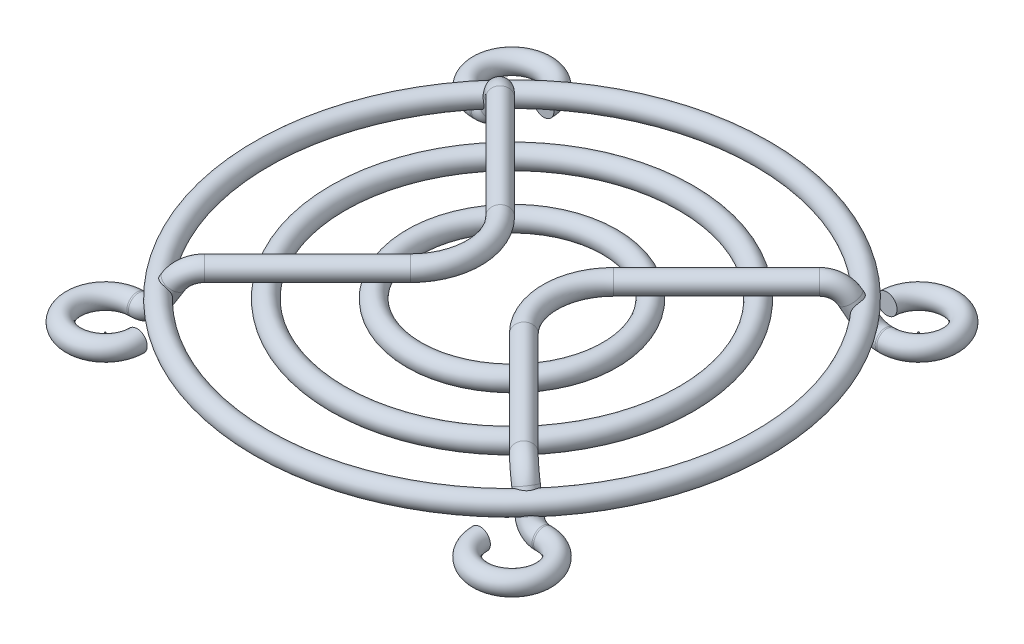
ISO-10303-21;
HEADER;
FILE_DESCRIPTION(('STEP AP214'),'2;1');
FILE_NAME('part.step','',(''),(''),'','','');
FILE_SCHEMA(('AUTOMOTIVE_DESIGN { 1 0 10303 214 1 1 1 1 }'));
ENDSEC;
DATA;
#1=APPLICATION_CONTEXT('core data for automotive mechanical design processes');
#2=APPLICATION_PROTOCOL_DEFINITION('international standard','automotive_design',2000,#1);
#3=PRODUCT_CONTEXT('',#1,'mechanical');
#4=PRODUCT('Part','Part','',(#3));
#5=PRODUCT_RELATED_PRODUCT_CATEGORY('part','',(#4));
#6=PRODUCT_DEFINITION_FORMATION('','',#4);
#7=PRODUCT_DEFINITION_CONTEXT('part definition',#1,'design');
#8=PRODUCT_DEFINITION('design','',#6,#7);
#9=PRODUCT_DEFINITION_SHAPE('','',#8);
#10=(LENGTH_UNIT() NAMED_UNIT(*) SI_UNIT(.MILLI.,.METRE.));
#11=(NAMED_UNIT(*) PLANE_ANGLE_UNIT() SI_UNIT($,.RADIAN.));
#12=(NAMED_UNIT(*) SI_UNIT($,.STERADIAN.) SOLID_ANGLE_UNIT());
#13=UNCERTAINTY_MEASURE_WITH_UNIT(LENGTH_MEASURE(1.E-05),#10,'distance_accuracy_value','');
#14=(GEOMETRIC_REPRESENTATION_CONTEXT(3) GLOBAL_UNCERTAINTY_ASSIGNED_CONTEXT((#13)) GLOBAL_UNIT_ASSIGNED_CONTEXT((#10,
#11,#12)) REPRESENTATION_CONTEXT('',''));
#15=CARTESIAN_POINT('',(0.,0.,0.));
#16=DIRECTION('',(0.,0.,1.));
#17=DIRECTION('',(1.,0.,0.));
#18=AXIS2_PLACEMENT_3D('',#15,#16,#17);
#19=CARTESIAN_POINT('',(16.,-2.3,-16.));
#20=DIRECTION('',(0.,-1.,0.));
#21=DIRECTION('',(0.,0.,-1.));
#22=AXIS2_PLACEMENT_3D('',#19,#20,#21);
#23=CYLINDRICAL_SURFACE('',#22,0.0528825222954187);
#24=CARTESIAN_POINT('',(16.,-2.3,-16.));
#25=DIRECTION('',(0.,1.,0.));
#26=DIRECTION('',(0.,0.,1.));
#27=AXIS2_PLACEMENT_3D('',#24,#25,#26);
#28=CIRCLE('',#27,0.0528825222954187);
#29=CARTESIAN_POINT('',(16.,-2.3,-15.9471174777046));
#30=VERTEX_POINT('',#29);
#31=EDGE_CURVE('E11',#30,#30,#28,.T.);
#32=ORIENTED_EDGE('',*,*,#31,.F.);
#33=EDGE_LOOP('',(#32));
#34=FACE_BOUND('',#33,.T.);
#35=CARTESIAN_POINT('',(16.,-2.4,-16.));
#36=DIRECTION('',(0.,1.,0.));
#37=DIRECTION('',(0.,0.,1.));
#38=AXIS2_PLACEMENT_3D('',#35,#36,#37);
#39=CIRCLE('',#38,0.0528825222954187);
#40=CARTESIAN_POINT('',(16.,-2.4,-15.9471174777046));
#41=VERTEX_POINT('',#40);
#42=EDGE_CURVE('E47',#41,#41,#39,.T.);
#43=ORIENTED_EDGE('',*,*,#42,.T.);
#44=EDGE_LOOP('',(#43));
#45=FACE_BOUND('',#44,.T.);
#46=ADVANCED_FACE('F44',(#34,#45),#23,.T.);
#47=CARTESIAN_POINT('',(0.,-2.3,0.));
#48=DIRECTION('',(0.,1.,0.));
#49=DIRECTION('',(0.,0.,1.));
#50=AXIS2_PLACEMENT_3D('',#47,#48,#49);
#51=PLANE('',#50);
#52=ORIENTED_EDGE('',*,*,#31,.T.);
#53=EDGE_LOOP('',(#52));
#54=FACE_BOUND('',#53,.T.);
#55=ADVANCED_FACE('F59',(#54),#51,.T.);
#56=CARTESIAN_POINT('',(0.,-2.4,0.));
#57=DIRECTION('',(0.,1.,0.));
#58=DIRECTION('',(0.,0.,1.));
#59=AXIS2_PLACEMENT_3D('',#56,#57,#58);
#60=PLANE('',#59);
#61=ORIENTED_EDGE('',*,*,#42,.F.);
#62=EDGE_LOOP('',(#61));
#63=FACE_BOUND('',#62,.T.);
#64=ADVANCED_FACE('F57',(#63),#60,.F.);
#65=CLOSED_SHELL('',(#46,#55,#64));
#66=MANIFOLD_SOLID_BREP('B2',#65);
#67=CARTESIAN_POINT('',(-16.,-2.3,16.));
#68=DIRECTION('',(0.,-1.,0.));
#69=DIRECTION('',(0.,0.,-1.));
#70=AXIS2_PLACEMENT_3D('',#67,#68,#69);
#71=CYLINDRICAL_SURFACE('',#70,0.0492604515738806);
#72=CARTESIAN_POINT('',(-16.,-2.3,16.));
#73=DIRECTION('',(0.,1.,0.));
#74=DIRECTION('',(0.,0.,1.));
#75=AXIS2_PLACEMENT_3D('',#72,#73,#74);
#76=CIRCLE('',#75,0.0492604515738806);
#77=CARTESIAN_POINT('',(-16.,-2.3,16.0492604515739));
#78=VERTEX_POINT('',#77);
#79=EDGE_CURVE('E43',#78,#78,#76,.T.);
#80=ORIENTED_EDGE('',*,*,#79,.F.);
#81=EDGE_LOOP('',(#80));
#82=FACE_BOUND('',#81,.T.);
#83=CARTESIAN_POINT('',(-16.,-2.4,16.));
#84=DIRECTION('',(0.,1.,0.));
#85=DIRECTION('',(0.,0.,1.));
#86=AXIS2_PLACEMENT_3D('',#83,#84,#85);
#87=CIRCLE('',#86,0.0492604515738806);
#88=CARTESIAN_POINT('',(-16.,-2.4,16.0492604515739));
#89=VERTEX_POINT('',#88);
#90=EDGE_CURVE('E96',#89,#89,#87,.T.);
#91=ORIENTED_EDGE('',*,*,#90,.T.);
#92=EDGE_LOOP('',(#91));
#93=FACE_BOUND('',#92,.T.);
#94=ADVANCED_FACE('F93',(#82,#93),#71,.T.);
#95=CARTESIAN_POINT('',(0.,-2.3,0.));
#96=DIRECTION('',(0.,1.,0.));
#97=DIRECTION('',(0.,0.,1.));
#98=AXIS2_PLACEMENT_3D('',#95,#96,#97);
#99=PLANE('',#98);
#100=ORIENTED_EDGE('',*,*,#79,.T.);
#101=EDGE_LOOP('',(#100));
#102=FACE_BOUND('',#101,.T.);
#103=ADVANCED_FACE('F108',(#102),#99,.T.);
#104=CARTESIAN_POINT('',(0.,-2.4,0.));
#105=DIRECTION('',(0.,1.,0.));
#106=DIRECTION('',(0.,0.,1.));
#107=AXIS2_PLACEMENT_3D('',#104,#105,#106);
#108=PLANE('',#107);
#109=ORIENTED_EDGE('',*,*,#90,.F.);
#110=EDGE_LOOP('',(#109));
#111=FACE_BOUND('',#110,.T.);
#112=ADVANCED_FACE('F106',(#111),#108,.F.);
#113=CLOSED_SHELL('',(#94,#103,#112));
#114=MANIFOLD_SOLID_BREP('B6',#113);
#115=CARTESIAN_POINT('',(16.,-1.6,-16.));
#116=DIRECTION('',(0.,-1.,0.));
#117=DIRECTION('',(0.,0.,-1.));
#118=AXIS2_PLACEMENT_3D('',#115,#116,#117);
#119=TOROIDAL_SURFACE('',#118,2.5,0.799999999999999);
#120=CARTESIAN_POINT('',(13.5,-1.6,-15.9999999999999));
#121=DIRECTION('',(0.,0.,-1.));
#122=DIRECTION('',(-1.,0.,0.));
#123=AXIS2_PLACEMENT_3D('',#120,#121,#122);
#124=CIRCLE('',#123,0.799999999999999);
#125=CARTESIAN_POINT('',(12.7,-1.6,-15.9999999999999));
#126=VERTEX_POINT('',#125);
#127=EDGE_CURVE('E92',#126,#126,#124,.T.);
#128=CARTESIAN_POINT('',(16.,-1.6,-13.5));
#129=DIRECTION('',(-1.,0.,0.));
#130=DIRECTION('',(0.,0.,1.));
#131=AXIS2_PLACEMENT_3D('',#128,#129,#130);
#132=CIRCLE('',#131,0.799999999999999);
#133=CARTESIAN_POINT('',(16.,-1.6,-12.7));
#134=VERTEX_POINT('',#133);
#135=EDGE_CURVE('E147',#134,#134,#132,.T.);
#136=CARTESIAN_POINT('',(16.,-1.6,-16.));
#137=DIRECTION('',(0.,-1.,0.));
#138=DIRECTION('',(0.,0.,-1.));
#139=AXIS2_PLACEMENT_3D('',#136,#137,#138);
#140=CIRCLE('',#139,3.3);
#141=EDGE_CURVE('',#126,#134,#140,.T.);
#142=ORIENTED_EDGE('',*,*,#127,.T.);
#143=ORIENTED_EDGE('',*,*,#135,.F.);
#144=ORIENTED_EDGE('',*,*,#141,.T.);
#145=ORIENTED_EDGE('',*,*,#141,.F.);
#146=EDGE_LOOP('',(#142,#144,#143,#145));
#147=FACE_BOUND('',#146,.T.);
#148=ADVANCED_FACE('F141',(#147),#119,.T.);
#149=CARTESIAN_POINT('',(15.8782443274926,-1.6,-13.5));
#150=DIRECTION('',(1.,0.,0.));
#151=DIRECTION('',(0.,-1.,0.));
#152=AXIS2_PLACEMENT_3D('',#149,#150,#151);
#153=CYLINDRICAL_SURFACE('',#152,0.799999999999999);
#154=CARTESIAN_POINT('',(15.8782443274926,-1.6,-13.5));
#155=DIRECTION('',(-1.,0.,0.));
#156=DIRECTION('',(0.,0.,1.));
#157=AXIS2_PLACEMENT_3D('',#154,#155,#156);
#158=CIRCLE('',#157,0.799999999999999);
#159=CARTESIAN_POINT('',(15.8782443274926,-2.35955153182212,-13.7511602486594));
#160=VERTEX_POINT('',#159);
#161=EDGE_CURVE('E151',#160,#160,#158,.T.);
#162=ORIENTED_EDGE('',*,*,#161,.F.);
#163=EDGE_LOOP('',(#162));
#164=FACE_BOUND('',#163,.T.);
#165=ORIENTED_EDGE('',*,*,#135,.T.);
#166=EDGE_LOOP('',(#165));
#167=FACE_BOUND('',#166,.T.);
#168=ADVANCED_FACE('F209',(#164,#167),#153,.T.);
#169=CARTESIAN_POINT('',(15.8782443274925,-0.27078481931128,-13.060469564846));
#170=DIRECTION('',(0.,0.313950310824281,-0.949439414777656));
#171=DIRECTION('',(0.,0.949439414777656,0.313950310824281));
#172=AXIS2_PLACEMENT_3D('',#169,#170,#171);
#173=TOROIDAL_SURFACE('',#172,1.4,0.799999999999999);
#174=CARTESIAN_POINT('',(14.617781817604,-0.849268726889301,-13.2517563386666));
#175=DIRECTION('',(-0.435207117690497,0.854809134098411,0.282658997687063));
#176=DIRECTION('',(0.282658997687048,-0.168351654670458,0.944331303831591));
#177=AXIS2_PLACEMENT_3D('',#174,#175,#176);
#178=CIRCLE('',#177,0.799999999999999);
#179=CARTESIAN_POINT('',(13.8975175262391,-1.17983095979103,-13.3610630665641));
#180=VERTEX_POINT('',#179);
#181=EDGE_CURVE('E155',#180,#180,#178,.T.);
#182=CARTESIAN_POINT('',(15.8782443274925,-0.27078481931128,-13.060469564846));
#183=DIRECTION('',(0.,0.313950310824281,-0.949439414777656));
#184=DIRECTION('',(0.,0.949439414777656,0.313950310824281));
#185=AXIS2_PLACEMENT_3D('',#182,#183,#184);
#186=CIRCLE('',#185,2.2);
#187=EDGE_CURVE('',#160,#180,#186,.T.);
#188=ORIENTED_EDGE('',*,*,#161,.T.);
#189=ORIENTED_EDGE('',*,*,#181,.F.);
#190=ORIENTED_EDGE('',*,*,#187,.T.);
#191=ORIENTED_EDGE('',*,*,#187,.F.);
#192=EDGE_LOOP('',(#188,#190,#189,#191));
#193=FACE_BOUND('',#192,.T.);
#194=ADVANCED_FACE('F214',(#193),#173,.T.);
#195=CARTESIAN_POINT('',(13.868227009508,0.622964309803443,-12.764934312657));
#196=DIRECTION('',(0.435207117690503,-0.854809134098413,-0.282658997687049));
#197=DIRECTION('',(-0.891149813497045,-0.453709168856199,0.));
#198=AXIS2_PLACEMENT_3D('',#195,#196,#197);
#199=CYLINDRICAL_SURFACE('',#198,0.799999999999999);
#200=CARTESIAN_POINT('',(13.868227009508,0.622964309803443,-12.764934312657));
#201=DIRECTION('',(-0.435207117690497,0.854809134098411,0.282658997687063));
#202=DIRECTION('',(0.282658997687048,-0.168351654670458,0.944331303831591));
#203=AXIS2_PLACEMENT_3D('',#200,#201,#202);
#204=CIRCLE('',#203,0.799999999999999);
#205=CARTESIAN_POINT('',(14.3196651347374,1.02585560697572,-13.2882718918086));
#206=VERTEX_POINT('',#205);
#207=EDGE_CURVE('E160',#206,#206,#204,.T.);
#208=ORIENTED_EDGE('',*,*,#207,.F.);
#209=EDGE_LOOP('',(#208));
#210=FACE_BOUND('',#209,.T.);
#211=ORIENTED_EDGE('',*,*,#181,.T.);
#212=EDGE_LOOP('',(#211));
#213=FACE_BOUND('',#212,.T.);
#214=ADVANCED_FACE('F219',(#210,#213),#199,.T.);
#215=CARTESIAN_POINT('',(12.7396316964346,-0.384263933127245,-11.4565903647781));
#216=DIRECTION('',(0.701543241389086,0.125196489258284,0.701543241389078));
#217=DIRECTION('',(-0.707106781186543,0.,0.707106781186551));
#218=AXIS2_PLACEMENT_3D('',#215,#216,#217);
#219=TOROIDAL_SURFACE('',#218,2.,0.799999999999999);
#220=CARTESIAN_POINT('',(12.5625771233641,1.6,-11.6336449378486));
#221=DIRECTION('',(-0.707106781186535,0.,0.707106781186561));
#222=DIRECTION('',(0.637166139093873,-0.43363420343009,0.637166139093846));
#223=AXIS2_PLACEMENT_3D('',#220,#221,#222);
#224=CIRCLE('',#223,0.799999999999999);
#225=CARTESIAN_POINT('',(12.4917552941358,2.3937055732509,-11.7044667670769));
#226=VERTEX_POINT('',#225);
#227=EDGE_CURVE('E163',#226,#226,#224,.T.);
#228=CARTESIAN_POINT('',(12.7396316964346,-0.384263933127245,-11.4565903647781));
#229=DIRECTION('',(0.701543241389086,0.125196489258284,0.701543241389078));
#230=DIRECTION('',(-0.707106781186543,0.,0.707106781186551));
#231=AXIS2_PLACEMENT_3D('',#228,#229,#230);
#232=CIRCLE('',#231,2.8);
#233=EDGE_CURVE('',#206,#226,#232,.T.);
#234=ORIENTED_EDGE('',*,*,#207,.T.);
#235=ORIENTED_EDGE('',*,*,#227,.F.);
#236=ORIENTED_EDGE('',*,*,#233,.T.);
#237=ORIENTED_EDGE('',*,*,#233,.F.);
#238=EDGE_LOOP('',(#234,#236,#235,#237));
#239=FACE_BOUND('',#238,.T.);
#240=ADVANCED_FACE('F226',(#239),#219,.T.);
#241=CARTESIAN_POINT('',(4.46446609275775,1.6,-3.53553390724225));
#242=DIRECTION('',(0.707106781186544,0.,-0.707106781186551));
#243=DIRECTION('',(0.707106781186551,0.,0.707106781186544));
#244=AXIS2_PLACEMENT_3D('',#241,#242,#243);
#245=CYLINDRICAL_SURFACE('',#244,0.799999999999999);
#246=CARTESIAN_POINT('',(4.46446609275775,1.6,-3.53553390724225));
#247=DIRECTION('',(-0.707106781186535,0.,0.707106781186561));
#248=DIRECTION('',(0.637166139093873,-0.43363420343009,0.637166139093846));
#249=AXIS2_PLACEMENT_3D('',#246,#247,#248);
#250=CIRCLE('',#249,0.799999999999999);
#251=CARTESIAN_POINT('',(3.89878066780852,1.6,-4.10121933219149));
#252=VERTEX_POINT('',#251);
#253=EDGE_CURVE('E166',#252,#252,#250,.T.);
#254=ORIENTED_EDGE('',*,*,#253,.F.);
#255=EDGE_LOOP('',(#254));
#256=FACE_BOUND('',#255,.T.);
#257=ORIENTED_EDGE('',*,*,#227,.T.);
#258=EDGE_LOOP('',(#257));
#259=FACE_BOUND('',#258,.T.);
#260=ADVANCED_FACE('F230',(#256,#259),#245,.T.);
#261=CARTESIAN_POINT('',(8.,1.6,0.));
#262=DIRECTION('',(0.,1.,0.));
#263=DIRECTION('',(0.,0.,1.));
#264=AXIS2_PLACEMENT_3D('',#261,#262,#263);
#265=TOROIDAL_SURFACE('',#264,5.00000000185193,0.799999999999999);
#266=CARTESIAN_POINT('',(4.46446609275775,1.6,3.53553390724226));
#267=DIRECTION('',(0.707106781186562,0.,0.707106781186533));
#268=DIRECTION('',(0.637166139093845,-0.43363420343009,-0.637166139093874));
#269=AXIS2_PLACEMENT_3D('',#266,#267,#268);
#270=CIRCLE('',#269,0.799999999999999);
#271=CARTESIAN_POINT('',(3.89878066780852,1.6,4.10121933219149));
#272=VERTEX_POINT('',#271);
#273=EDGE_CURVE('E169',#272,#272,#270,.T.);
#274=CARTESIAN_POINT('',(8.,1.6,0.));
#275=DIRECTION('',(0.,1.,0.));
#276=DIRECTION('',(0.,0.,1.));
#277=AXIS2_PLACEMENT_3D('',#274,#275,#276);
#278=CIRCLE('',#277,5.80000000185193);
#279=EDGE_CURVE('',#252,#272,#278,.T.);
#280=ORIENTED_EDGE('',*,*,#253,.T.);
#281=ORIENTED_EDGE('',*,*,#273,.F.);
#282=ORIENTED_EDGE('',*,*,#279,.T.);
#283=ORIENTED_EDGE('',*,*,#279,.F.);
#284=EDGE_LOOP('',(#280,#282,#281,#283));
#285=FACE_BOUND('',#284,.T.);
#286=ADVANCED_FACE('F234',(#285),#265,.T.);
#287=CARTESIAN_POINT('',(12.5625771233642,1.6,11.6336449378485));
#288=DIRECTION('',(-0.707106781186554,0.,-0.707106781186541));
#289=DIRECTION('',(0.707106781186541,0.,-0.707106781186554));
#290=AXIS2_PLACEMENT_3D('',#287,#288,#289);
#291=CYLINDRICAL_SURFACE('',#290,0.799999999999999);
#292=CARTESIAN_POINT('',(12.5625771233642,1.6,11.6336449378485));
#293=DIRECTION('',(0.707106781186562,0.,0.707106781186533));
#294=DIRECTION('',(0.637166139093845,-0.43363420343009,-0.637166139093874));
#295=AXIS2_PLACEMENT_3D('',#292,#293,#294);
#296=CIRCLE('',#295,0.799999999999999);
#297=CARTESIAN_POINT('',(12.491755294136,2.3937055732509,11.7044667670767));
#298=VERTEX_POINT('',#297);
#299=EDGE_CURVE('E172',#298,#298,#296,.T.);
#300=ORIENTED_EDGE('',*,*,#299,.F.);
#301=EDGE_LOOP('',(#300));
#302=FACE_BOUND('',#301,.T.);
#303=ORIENTED_EDGE('',*,*,#273,.T.);
#304=EDGE_LOOP('',(#303));
#305=FACE_BOUND('',#304,.T.);
#306=ADVANCED_FACE('F238',(#302,#305),#291,.T.);
#307=CARTESIAN_POINT('',(12.7396316964347,-0.38426393312726,11.4565903647781));
#308=DIRECTION('',(0.701543241389082,0.125196489258224,-0.701543241389094));
#309=DIRECTION('',(0.707106781186554,0.,0.707106781186541));
#310=AXIS2_PLACEMENT_3D('',#307,#308,#309);
#311=TOROIDAL_SURFACE('',#310,2.,0.799999999999999);
#312=CARTESIAN_POINT('',(13.8682270095081,0.62296430980346,12.764934312657));
#313=DIRECTION('',(0.435207117690463,-0.85480913409843,0.282658997687058));
#314=DIRECTION('',(0.282658997687064,-0.168351654670452,-0.944331303831587));
#315=AXIS2_PLACEMENT_3D('',#312,#313,#314);
#316=CIRCLE('',#315,0.799999999999999);
#317=CARTESIAN_POINT('',(14.3196651347375,1.02585560697575,13.2882718918085));
#318=VERTEX_POINT('',#317);
#319=EDGE_CURVE('E175',#318,#318,#316,.T.);
#320=CARTESIAN_POINT('',(12.7396316964347,-0.38426393312726,11.4565903647781));
#321=DIRECTION('',(0.701543241389082,0.125196489258224,-0.701543241389094));
#322=DIRECTION('',(0.707106781186554,0.,0.707106781186541));
#323=AXIS2_PLACEMENT_3D('',#320,#321,#322);
#324=CIRCLE('',#323,2.8);
#325=EDGE_CURVE('',#298,#318,#324,.T.);
#326=ORIENTED_EDGE('',*,*,#299,.T.);
#327=ORIENTED_EDGE('',*,*,#319,.F.);
#328=ORIENTED_EDGE('',*,*,#325,.T.);
#329=ORIENTED_EDGE('',*,*,#325,.F.);
#330=EDGE_LOOP('',(#326,#328,#327,#329));
#331=FACE_BOUND('',#330,.T.);
#332=ADVANCED_FACE('F242',(#331),#311,.T.);
#333=CARTESIAN_POINT('',(14.6177818176039,-0.8492687268892,13.2517563386666));
#334=DIRECTION('',(-0.435207117690459,0.854809134098428,-0.282658997687071));
#335=DIRECTION('',(0.891149813497066,0.453709168856156,0.));
#336=AXIS2_PLACEMENT_3D('',#333,#334,#335);
#337=CYLINDRICAL_SURFACE('',#336,0.799999999999999);
#338=CARTESIAN_POINT('',(14.6177818176039,-0.8492687268892,13.2517563386666));
#339=DIRECTION('',(0.435207117690463,-0.85480913409843,0.282658997687058));
#340=DIRECTION('',(0.282658997687064,-0.168351654670452,-0.944331303831587));
#341=AXIS2_PLACEMENT_3D('',#338,#339,#340);
#342=CIRCLE('',#341,0.799999999999999);
#343=CARTESIAN_POINT('',(13.897517526239,-1.17983095979086,13.3610630665641));
#344=VERTEX_POINT('',#343);
#345=EDGE_CURVE('E178',#344,#344,#342,.T.);
#346=ORIENTED_EDGE('',*,*,#345,.F.);
#347=EDGE_LOOP('',(#346));
#348=FACE_BOUND('',#347,.T.);
#349=ORIENTED_EDGE('',*,*,#319,.T.);
#350=EDGE_LOOP('',(#349));
#351=FACE_BOUND('',#350,.T.);
#352=ADVANCED_FACE('F246',(#348,#351),#337,.T.);
#353=CARTESIAN_POINT('',(15.8782443274926,-0.270784819311289,13.060469564846));
#354=DIRECTION('',(0.,0.313950310824296,0.949439414777651));
#355=DIRECTION('',(0.,-0.949439414777651,0.313950310824296));
#356=AXIS2_PLACEMENT_3D('',#353,#354,#355);
#357=TOROIDAL_SURFACE('',#356,1.4,0.799999999999999);
#358=CARTESIAN_POINT('',(15.8782443274925,-1.6,13.5));
#359=DIRECTION('',(1.,0.,0.));
#360=DIRECTION('',(0.,0.,-1.));
#361=AXIS2_PLACEMENT_3D('',#358,#359,#360);
#362=CIRCLE('',#361,0.799999999999999);
#363=CARTESIAN_POINT('',(15.8782443274925,-2.35955153182212,13.7511602486594));
#364=VERTEX_POINT('',#363);
#365=EDGE_CURVE('E181',#364,#364,#362,.T.);
#366=CARTESIAN_POINT('',(15.8782443274926,-0.270784819311289,13.060469564846));
#367=DIRECTION('',(0.,0.313950310824296,0.949439414777651));
#368=DIRECTION('',(0.,-0.949439414777651,0.313950310824296));
#369=AXIS2_PLACEMENT_3D('',#366,#367,#368);
#370=CIRCLE('',#369,2.2);
#371=EDGE_CURVE('',#344,#364,#370,.T.);
#372=ORIENTED_EDGE('',*,*,#345,.T.);
#373=ORIENTED_EDGE('',*,*,#365,.F.);
#374=ORIENTED_EDGE('',*,*,#371,.T.);
#375=ORIENTED_EDGE('',*,*,#371,.F.);
#376=EDGE_LOOP('',(#372,#374,#373,#375));
#377=FACE_BOUND('',#376,.T.);
#378=ADVANCED_FACE('F205',(#377),#357,.T.);
#379=CARTESIAN_POINT('',(16.,-1.6,13.5));
#380=DIRECTION('',(-1.,0.,0.));
#381=DIRECTION('',(0.,1.,0.));
#382=AXIS2_PLACEMENT_3D('',#379,#380,#381);
#383=CYLINDRICAL_SURFACE('',#382,0.799999999999999);
#384=CARTESIAN_POINT('',(16.,-1.6,13.5));
#385=DIRECTION('',(1.,0.,0.));
#386=DIRECTION('',(0.,0.,-1.));
#387=AXIS2_PLACEMENT_3D('',#384,#385,#386);
#388=CIRCLE('',#387,0.799999999999999);
#389=CARTESIAN_POINT('',(16.,-1.6,12.7));
#390=VERTEX_POINT('',#389);
#391=EDGE_CURVE('E184',#390,#390,#388,.T.);
#392=ORIENTED_EDGE('',*,*,#391,.F.);
#393=EDGE_LOOP('',(#392));
#394=FACE_BOUND('',#393,.T.);
#395=ORIENTED_EDGE('',*,*,#365,.T.);
#396=EDGE_LOOP('',(#395));
#397=FACE_BOUND('',#396,.T.);
#398=ADVANCED_FACE('F196',(#394,#397),#383,.T.);
#399=CARTESIAN_POINT('',(16.,-1.6,16.));
#400=DIRECTION('',(0.,1.,0.));
#401=DIRECTION('',(0.,0.,1.));
#402=AXIS2_PLACEMENT_3D('',#399,#400,#401);
#403=TOROIDAL_SURFACE('',#402,2.5,0.799999999999999);
#404=CARTESIAN_POINT('',(13.5,-1.6,16.));
#405=DIRECTION('',(0.,0.,-1.));
#406=DIRECTION('',(-1.,0.,0.));
#407=AXIS2_PLACEMENT_3D('',#404,#405,#406);
#408=CIRCLE('',#407,0.799999999999999);
#409=CARTESIAN_POINT('',(12.7,-1.6,16.));
#410=VERTEX_POINT('',#409);
#411=EDGE_CURVE('E187',#410,#410,#408,.T.);
#412=CARTESIAN_POINT('',(16.,-1.6,16.));
#413=DIRECTION('',(0.,1.,0.));
#414=DIRECTION('',(0.,0.,1.));
#415=AXIS2_PLACEMENT_3D('',#412,#413,#414);
#416=CIRCLE('',#415,3.3);
#417=EDGE_CURVE('',#410,#390,#416,.T.);
#418=ORIENTED_EDGE('',*,*,#411,.F.);
#419=ORIENTED_EDGE('',*,*,#391,.T.);
#420=ORIENTED_EDGE('',*,*,#417,.T.);
#421=ORIENTED_EDGE('',*,*,#417,.F.);
#422=EDGE_LOOP('',(#418,#420,#419,#421));
#423=FACE_BOUND('',#422,.T.);
#424=ADVANCED_FACE('F193',(#423),#403,.T.);
#425=CARTESIAN_POINT('',(13.5,-1.6,-15.9999999999999));
#426=DIRECTION('',(0.,0.,1.));
#427=DIRECTION('',(-1.,0.,0.));
#428=AXIS2_PLACEMENT_3D('',#425,#426,#427);
#429=PLANE('',#428);
#430=ORIENTED_EDGE('',*,*,#127,.F.);
#431=EDGE_LOOP('',(#430));
#432=FACE_BOUND('',#431,.T.);
#433=ADVANCED_FACE('F195',(#432),#429,.T.);
#434=CARTESIAN_POINT('',(13.5,-1.6,16.));
#435=DIRECTION('',(0.,0.,1.));
#436=DIRECTION('',(-1.,0.,0.));
#437=AXIS2_PLACEMENT_3D('',#434,#435,#436);
#438=PLANE('',#437);
#439=ORIENTED_EDGE('',*,*,#411,.T.);
#440=EDGE_LOOP('',(#439));
#441=FACE_BOUND('',#440,.T.);
#442=ADVANCED_FACE('F191',(#441),#438,.F.);
#443=CLOSED_SHELL('',(#148,#168,#194,#214,#240,#260,#286,#306,#332,#352,#378,#398,#424,#433,#442));
#444=MANIFOLD_SOLID_BREP('B38',#443);
#445=CARTESIAN_POINT('',(-16.,-1.6,-16.));
#446=DIRECTION('',(0.,-1.,0.));
#447=DIRECTION('',(0.,0.,-1.));
#448=AXIS2_PLACEMENT_3D('',#445,#446,#447);
#449=TOROIDAL_SURFACE('',#448,2.5,0.799999999999999);
#450=CARTESIAN_POINT('',(-16.,-1.6,-13.5));
#451=DIRECTION('',(-1.,0.,0.));
#452=DIRECTION('',(0.,0.,1.));
#453=AXIS2_PLACEMENT_3D('',#450,#451,#452);
#454=CIRCLE('',#453,0.799999999999999);
#455=CARTESIAN_POINT('',(-16.,-1.6,-12.7));
#456=VERTEX_POINT('',#455);
#457=EDGE_CURVE('E373',#456,#456,#454,.T.);
#458=CARTESIAN_POINT('',(-13.5,-1.6,-15.9999999999999));
#459=DIRECTION('',(0.,0.,1.));
#460=DIRECTION('',(1.,0.,0.));
#461=AXIS2_PLACEMENT_3D('',#458,#459,#460);
#462=CIRCLE('',#461,0.799999999999999);
#463=CARTESIAN_POINT('',(-12.7,-1.6,-15.9999999999999));
#464=VERTEX_POINT('',#463);
#465=EDGE_CURVE('E140',#464,#464,#462,.T.);
#466=CARTESIAN_POINT('',(-16.,-1.6,-16.));
#467=DIRECTION('',(0.,-1.,0.));
#468=DIRECTION('',(0.,0.,-1.));
#469=AXIS2_PLACEMENT_3D('',#466,#467,#468);
#470=CIRCLE('',#469,3.3);
#471=EDGE_CURVE('',#456,#464,#470,.T.);
#472=ORIENTED_EDGE('',*,*,#457,.T.);
#473=ORIENTED_EDGE('',*,*,#465,.F.);
#474=ORIENTED_EDGE('',*,*,#471,.T.);
#475=ORIENTED_EDGE('',*,*,#471,.F.);
#476=EDGE_LOOP('',(#472,#474,#473,#475));
#477=FACE_BOUND('',#476,.T.);
#478=ADVANCED_FACE('F367',(#477),#449,.T.);
#479=CARTESIAN_POINT('',(-15.8782443274926,-1.6,-13.5));
#480=DIRECTION('',(-1.,0.,0.));
#481=DIRECTION('',(0.,-1.,0.));
#482=AXIS2_PLACEMENT_3D('',#479,#480,#481);
#483=CYLINDRICAL_SURFACE('',#482,0.799999999999999);
#484=CARTESIAN_POINT('',(-15.8782443274926,-1.6,-13.5));
#485=DIRECTION('',(-1.,0.,0.));
#486=DIRECTION('',(0.,0.,1.));
#487=AXIS2_PLACEMENT_3D('',#484,#485,#486);
#488=CIRCLE('',#487,0.799999999999999);
#489=CARTESIAN_POINT('',(-15.8782443274926,-2.35955153182212,-13.7511602486594));
#490=VERTEX_POINT('',#489);
#491=EDGE_CURVE('E377',#490,#490,#488,.T.);
#492=ORIENTED_EDGE('',*,*,#491,.T.);
#493=EDGE_LOOP('',(#492));
#494=FACE_BOUND('',#493,.T.);
#495=ORIENTED_EDGE('',*,*,#457,.F.);
#496=EDGE_LOOP('',(#495));
#497=FACE_BOUND('',#496,.T.);
#498=ADVANCED_FACE('F428',(#494,#497),#483,.T.);
#499=CARTESIAN_POINT('',(-15.8782443274925,-0.27078481931128,-13.060469564846));
#500=DIRECTION('',(0.,0.313950310824281,-0.949439414777656));
#501=DIRECTION('',(0.,0.949439414777656,0.313950310824281));
#502=AXIS2_PLACEMENT_3D('',#499,#500,#501);
#503=TOROIDAL_SURFACE('',#502,1.4,0.799999999999999);
#504=CARTESIAN_POINT('',(-14.617781817604,-0.849268726889301,-13.2517563386666));
#505=DIRECTION('',(-0.435207117690497,-0.854809134098411,-0.282658997687063));
#506=DIRECTION('',(-0.282658997687048,-0.168351654670458,0.944331303831591));
#507=AXIS2_PLACEMENT_3D('',#504,#505,#506);
#508=CIRCLE('',#507,0.799999999999999);
#509=CARTESIAN_POINT('',(-13.8975175262391,-1.17983095979103,-13.3610630665641));
#510=VERTEX_POINT('',#509);
#511=EDGE_CURVE('E381',#510,#510,#508,.T.);
#512=CARTESIAN_POINT('',(-15.8782443274925,-0.27078481931128,-13.060469564846));
#513=DIRECTION('',(0.,0.313950310824281,-0.949439414777656));
#514=DIRECTION('',(0.,0.949439414777656,0.313950310824281));
#515=AXIS2_PLACEMENT_3D('',#512,#513,#514);
#516=CIRCLE('',#515,2.2);
#517=EDGE_CURVE('',#510,#490,#516,.T.);
#518=ORIENTED_EDGE('',*,*,#511,.T.);
#519=ORIENTED_EDGE('',*,*,#491,.F.);
#520=ORIENTED_EDGE('',*,*,#517,.T.);
#521=ORIENTED_EDGE('',*,*,#517,.F.);
#522=EDGE_LOOP('',(#518,#520,#519,#521));
#523=FACE_BOUND('',#522,.T.);
#524=ADVANCED_FACE('F432',(#523),#503,.T.);
#525=CARTESIAN_POINT('',(-13.868227009508,0.622964309803443,-12.764934312657));
#526=DIRECTION('',(-0.435207117690503,-0.854809134098413,-0.282658997687049));
#527=DIRECTION('',(0.891149813497045,-0.453709168856199,0.));
#528=AXIS2_PLACEMENT_3D('',#525,#526,#527);
#529=CYLINDRICAL_SURFACE('',#528,0.799999999999999);
#530=CARTESIAN_POINT('',(-13.868227009508,0.622964309803443,-12.764934312657));
#531=DIRECTION('',(-0.435207117690497,-0.854809134098411,-0.282658997687063));
#532=DIRECTION('',(-0.282658997687048,-0.168351654670458,0.944331303831591));
#533=AXIS2_PLACEMENT_3D('',#530,#531,#532);
#534=CIRCLE('',#533,0.799999999999999);
#535=CARTESIAN_POINT('',(-14.3196651347374,1.02585560697572,-13.2882718918086));
#536=VERTEX_POINT('',#535);
#537=EDGE_CURVE('E386',#536,#536,#534,.T.);
#538=ORIENTED_EDGE('',*,*,#537,.T.);
#539=EDGE_LOOP('',(#538));
#540=FACE_BOUND('',#539,.T.);
#541=ORIENTED_EDGE('',*,*,#511,.F.);
#542=EDGE_LOOP('',(#541));
#543=FACE_BOUND('',#542,.T.);
#544=ADVANCED_FACE('F438',(#540,#543),#529,.T.);
#545=CARTESIAN_POINT('',(-12.7396316964346,-0.384263933127245,-11.4565903647781));
#546=DIRECTION('',(-0.701543241389086,0.125196489258284,0.701543241389078));
#547=DIRECTION('',(0.707106781186543,0.,0.707106781186551));
#548=AXIS2_PLACEMENT_3D('',#545,#546,#547);
#549=TOROIDAL_SURFACE('',#548,2.,0.799999999999999);
#550=CARTESIAN_POINT('',(-12.5625771233641,1.6,-11.6336449378486));
#551=DIRECTION('',(-0.707106781186535,0.,-0.707106781186561));
#552=DIRECTION('',(-0.637166139093873,-0.43363420343009,0.637166139093846));
#553=AXIS2_PLACEMENT_3D('',#550,#551,#552);
#554=CIRCLE('',#553,0.799999999999999);
#555=CARTESIAN_POINT('',(-12.4917552941358,2.3937055732509,-11.7044667670769));
#556=VERTEX_POINT('',#555);
#557=EDGE_CURVE('E389',#556,#556,#554,.T.);
#558=CARTESIAN_POINT('',(-12.7396316964346,-0.384263933127245,-11.4565903647781));
#559=DIRECTION('',(-0.701543241389086,0.125196489258284,0.701543241389078));
#560=DIRECTION('',(0.707106781186543,0.,0.707106781186551));
#561=AXIS2_PLACEMENT_3D('',#558,#559,#560);
#562=CIRCLE('',#561,2.8);
#563=EDGE_CURVE('',#556,#536,#562,.T.);
#564=ORIENTED_EDGE('',*,*,#557,.T.);
#565=ORIENTED_EDGE('',*,*,#537,.F.);
#566=ORIENTED_EDGE('',*,*,#563,.T.);
#567=ORIENTED_EDGE('',*,*,#563,.F.);
#568=EDGE_LOOP('',(#564,#566,#565,#567));
#569=FACE_BOUND('',#568,.T.);
#570=ADVANCED_FACE('F445',(#569),#549,.T.);
#571=CARTESIAN_POINT('',(-4.46446609275775,1.6,-3.53553390724225));
#572=DIRECTION('',(-0.707106781186544,0.,-0.707106781186551));
#573=DIRECTION('',(-0.707106781186551,0.,0.707106781186544));
#574=AXIS2_PLACEMENT_3D('',#571,#572,#573);
#575=CYLINDRICAL_SURFACE('',#574,0.799999999999999);
#576=CARTESIAN_POINT('',(-4.46446609275775,1.6,-3.53553390724225));
#577=DIRECTION('',(-0.707106781186535,0.,-0.707106781186561));
#578=DIRECTION('',(-0.637166139093873,-0.43363420343009,0.637166139093846));
#579=AXIS2_PLACEMENT_3D('',#576,#577,#578);
#580=CIRCLE('',#579,0.799999999999999);
#581=CARTESIAN_POINT('',(-3.89878066780852,1.6,-4.10121933219149));
#582=VERTEX_POINT('',#581);
#583=EDGE_CURVE('E392',#582,#582,#580,.T.);
#584=ORIENTED_EDGE('',*,*,#583,.T.);
#585=EDGE_LOOP('',(#584));
#586=FACE_BOUND('',#585,.T.);
#587=ORIENTED_EDGE('',*,*,#557,.F.);
#588=EDGE_LOOP('',(#587));
#589=FACE_BOUND('',#588,.T.);
#590=ADVANCED_FACE('F449',(#586,#589),#575,.T.);
#591=CARTESIAN_POINT('',(-8.,1.6,0.));
#592=DIRECTION('',(0.,1.,0.));
#593=DIRECTION('',(0.,0.,1.));
#594=AXIS2_PLACEMENT_3D('',#591,#592,#593);
#595=TOROIDAL_SURFACE('',#594,5.00000000185193,0.799999999999999);
#596=CARTESIAN_POINT('',(-4.46446609275775,1.6,3.53553390724226));
#597=DIRECTION('',(0.707106781186562,0.,-0.707106781186533));
#598=DIRECTION('',(-0.637166139093845,-0.43363420343009,-0.637166139093874));
#599=AXIS2_PLACEMENT_3D('',#596,#597,#598);
#600=CIRCLE('',#599,0.799999999999999);
#601=CARTESIAN_POINT('',(-3.89878066780852,1.6,4.10121933219149));
#602=VERTEX_POINT('',#601);
#603=EDGE_CURVE('E395',#602,#602,#600,.T.);
#604=CARTESIAN_POINT('',(-8.,1.6,0.));
#605=DIRECTION('',(0.,1.,0.));
#606=DIRECTION('',(0.,0.,1.));
#607=AXIS2_PLACEMENT_3D('',#604,#605,#606);
#608=CIRCLE('',#607,5.80000000185193);
#609=EDGE_CURVE('',#602,#582,#608,.T.);
#610=ORIENTED_EDGE('',*,*,#603,.T.);
#611=ORIENTED_EDGE('',*,*,#583,.F.);
#612=ORIENTED_EDGE('',*,*,#609,.T.);
#613=ORIENTED_EDGE('',*,*,#609,.F.);
#614=EDGE_LOOP('',(#610,#612,#611,#613));
#615=FACE_BOUND('',#614,.T.);
#616=ADVANCED_FACE('F453',(#615),#595,.T.);
#617=CARTESIAN_POINT('',(-12.5625771233642,1.6,11.6336449378485));
#618=DIRECTION('',(0.707106781186554,0.,-0.707106781186541));
#619=DIRECTION('',(-0.707106781186541,0.,-0.707106781186554));
#620=AXIS2_PLACEMENT_3D('',#617,#618,#619);
#621=CYLINDRICAL_SURFACE('',#620,0.799999999999999);
#622=CARTESIAN_POINT('',(-12.5625771233642,1.6,11.6336449378485));
#623=DIRECTION('',(0.707106781186562,0.,-0.707106781186533));
#624=DIRECTION('',(-0.637166139093845,-0.43363420343009,-0.637166139093874));
#625=AXIS2_PLACEMENT_3D('',#622,#623,#624);
#626=CIRCLE('',#625,0.799999999999999);
#627=CARTESIAN_POINT('',(-12.491755294136,2.3937055732509,11.7044667670767));
#628=VERTEX_POINT('',#627);
#629=EDGE_CURVE('E398',#628,#628,#626,.T.);
#630=ORIENTED_EDGE('',*,*,#629,.T.);
#631=EDGE_LOOP('',(#630));
#632=FACE_BOUND('',#631,.T.);
#633=ORIENTED_EDGE('',*,*,#603,.F.);
#634=EDGE_LOOP('',(#633));
#635=FACE_BOUND('',#634,.T.);
#636=ADVANCED_FACE('F457',(#632,#635),#621,.T.);
#637=CARTESIAN_POINT('',(-12.7396316964347,-0.38426393312726,11.4565903647781));
#638=DIRECTION('',(-0.701543241389082,0.125196489258224,-0.701543241389094));
#639=DIRECTION('',(-0.707106781186554,0.,0.707106781186541));
#640=AXIS2_PLACEMENT_3D('',#637,#638,#639);
#641=TOROIDAL_SURFACE('',#640,2.,0.799999999999999);
#642=CARTESIAN_POINT('',(-13.8682270095081,0.62296430980346,12.764934312657));
#643=DIRECTION('',(0.435207117690463,0.85480913409843,-0.282658997687058));
#644=DIRECTION('',(-0.282658997687064,-0.168351654670452,-0.944331303831587));
#645=AXIS2_PLACEMENT_3D('',#642,#643,#644);
#646=CIRCLE('',#645,0.799999999999999);
#647=CARTESIAN_POINT('',(-14.3196651347375,1.02585560697575,13.2882718918085));
#648=VERTEX_POINT('',#647);
#649=EDGE_CURVE('E401',#648,#648,#646,.T.);
#650=CARTESIAN_POINT('',(-12.7396316964347,-0.38426393312726,11.4565903647781));
#651=DIRECTION('',(-0.701543241389082,0.125196489258224,-0.701543241389094));
#652=DIRECTION('',(-0.707106781186554,0.,0.707106781186541));
#653=AXIS2_PLACEMENT_3D('',#650,#651,#652);
#654=CIRCLE('',#653,2.8);
#655=EDGE_CURVE('',#648,#628,#654,.T.);
#656=ORIENTED_EDGE('',*,*,#649,.T.);
#657=ORIENTED_EDGE('',*,*,#629,.F.);
#658=ORIENTED_EDGE('',*,*,#655,.T.);
#659=ORIENTED_EDGE('',*,*,#655,.F.);
#660=EDGE_LOOP('',(#656,#658,#657,#659));
#661=FACE_BOUND('',#660,.T.);
#662=ADVANCED_FACE('F461',(#661),#641,.T.);
#663=CARTESIAN_POINT('',(-14.6177818176039,-0.8492687268892,13.2517563386666));
#664=DIRECTION('',(0.435207117690459,0.854809134098428,-0.282658997687071));
#665=DIRECTION('',(-0.891149813497066,0.453709168856156,0.));
#666=AXIS2_PLACEMENT_3D('',#663,#664,#665);
#667=CYLINDRICAL_SURFACE('',#666,0.799999999999999);
#668=CARTESIAN_POINT('',(-14.6177818176039,-0.8492687268892,13.2517563386666));
#669=DIRECTION('',(0.435207117690463,0.85480913409843,-0.282658997687058));
#670=DIRECTION('',(-0.282658997687064,-0.168351654670452,-0.944331303831587));
#671=AXIS2_PLACEMENT_3D('',#668,#669,#670);
#672=CIRCLE('',#671,0.799999999999999);
#673=CARTESIAN_POINT('',(-13.897517526239,-1.17983095979086,13.3610630665641));
#674=VERTEX_POINT('',#673);
#675=EDGE_CURVE('E404',#674,#674,#672,.T.);
#676=ORIENTED_EDGE('',*,*,#675,.T.);
#677=EDGE_LOOP('',(#676));
#678=FACE_BOUND('',#677,.T.);
#679=ORIENTED_EDGE('',*,*,#649,.F.);
#680=EDGE_LOOP('',(#679));
#681=FACE_BOUND('',#680,.T.);
#682=ADVANCED_FACE('F465',(#678,#681),#667,.T.);
#683=CARTESIAN_POINT('',(-15.8782443274926,-0.270784819311289,13.060469564846));
#684=DIRECTION('',(0.,0.313950310824296,0.949439414777651));
#685=DIRECTION('',(0.,-0.949439414777651,0.313950310824296));
#686=AXIS2_PLACEMENT_3D('',#683,#684,#685);
#687=TOROIDAL_SURFACE('',#686,1.4,0.799999999999999);
#688=CARTESIAN_POINT('',(-15.8782443274925,-1.6,13.5));
#689=DIRECTION('',(1.,0.,0.));
#690=DIRECTION('',(0.,0.,-1.));
#691=AXIS2_PLACEMENT_3D('',#688,#689,#690);
#692=CIRCLE('',#691,0.799999999999999);
#693=CARTESIAN_POINT('',(-15.8782443274925,-2.35955153182212,13.7511602486594));
#694=VERTEX_POINT('',#693);
#695=EDGE_CURVE('E407',#694,#694,#692,.T.);
#696=CARTESIAN_POINT('',(-15.8782443274926,-0.270784819311289,13.060469564846));
#697=DIRECTION('',(0.,0.313950310824296,0.949439414777651));
#698=DIRECTION('',(0.,-0.949439414777651,0.313950310824296));
#699=AXIS2_PLACEMENT_3D('',#696,#697,#698);
#700=CIRCLE('',#699,2.2);
#701=EDGE_CURVE('',#694,#674,#700,.T.);
#702=ORIENTED_EDGE('',*,*,#695,.T.);
#703=ORIENTED_EDGE('',*,*,#675,.F.);
#704=ORIENTED_EDGE('',*,*,#701,.T.);
#705=ORIENTED_EDGE('',*,*,#701,.F.);
#706=EDGE_LOOP('',(#702,#704,#703,#705));
#707=FACE_BOUND('',#706,.T.);
#708=ADVANCED_FACE('F469',(#707),#687,.T.);
#709=CARTESIAN_POINT('',(-16.,-1.6,13.5));
#710=DIRECTION('',(1.,0.,0.));
#711=DIRECTION('',(0.,1.,0.));
#712=AXIS2_PLACEMENT_3D('',#709,#710,#711);
#713=CYLINDRICAL_SURFACE('',#712,0.799999999999999);
#714=CARTESIAN_POINT('',(-16.,-1.6,13.5));
#715=DIRECTION('',(1.,0.,0.));
#716=DIRECTION('',(0.,0.,-1.));
#717=AXIS2_PLACEMENT_3D('',#714,#715,#716);
#718=CIRCLE('',#717,0.799999999999999);
#719=CARTESIAN_POINT('',(-16.,-1.6,12.7));
#720=VERTEX_POINT('',#719);
#721=EDGE_CURVE('E410',#720,#720,#718,.T.);
#722=ORIENTED_EDGE('',*,*,#721,.T.);
#723=EDGE_LOOP('',(#722));
#724=FACE_BOUND('',#723,.T.);
#725=ORIENTED_EDGE('',*,*,#695,.F.);
#726=EDGE_LOOP('',(#725));
#727=FACE_BOUND('',#726,.T.);
#728=ADVANCED_FACE('F473',(#724,#727),#713,.T.);
#729=CARTESIAN_POINT('',(-16.,-1.6,16.));
#730=DIRECTION('',(0.,1.,0.));
#731=DIRECTION('',(0.,0.,1.));
#732=AXIS2_PLACEMENT_3D('',#729,#730,#731);
#733=TOROIDAL_SURFACE('',#732,2.5,0.799999999999999);
#734=CARTESIAN_POINT('',(-13.5,-1.6,16.));
#735=DIRECTION('',(0.,0.,1.));
#736=DIRECTION('',(1.,0.,0.));
#737=AXIS2_PLACEMENT_3D('',#734,#735,#736);
#738=CIRCLE('',#737,0.799999999999999);
#739=CARTESIAN_POINT('',(-12.7,-1.6,16.));
#740=VERTEX_POINT('',#739);
#741=EDGE_CURVE('E413',#740,#740,#738,.T.);
#742=CARTESIAN_POINT('',(-16.,-1.6,16.));
#743=DIRECTION('',(0.,1.,0.));
#744=DIRECTION('',(0.,0.,1.));
#745=AXIS2_PLACEMENT_3D('',#742,#743,#744);
#746=CIRCLE('',#745,3.3);
#747=EDGE_CURVE('',#720,#740,#746,.T.);
#748=ORIENTED_EDGE('',*,*,#721,.F.);
#749=ORIENTED_EDGE('',*,*,#741,.T.);
#750=ORIENTED_EDGE('',*,*,#747,.T.);
#751=ORIENTED_EDGE('',*,*,#747,.F.);
#752=EDGE_LOOP('',(#748,#750,#749,#751));
#753=FACE_BOUND('',#752,.T.);
#754=ADVANCED_FACE('F417',(#753),#733,.T.);
#755=CARTESIAN_POINT('',(-13.5,-1.6,-15.9999999999999));
#756=DIRECTION('',(0.,0.,1.));
#757=DIRECTION('',(1.,0.,0.));
#758=AXIS2_PLACEMENT_3D('',#755,#756,#757);
#759=PLANE('',#758);
#760=ORIENTED_EDGE('',*,*,#465,.T.);
#761=EDGE_LOOP('',(#760));
#762=FACE_BOUND('',#761,.T.);
#763=ADVANCED_FACE('F421',(#762),#759,.T.);
#764=CARTESIAN_POINT('',(-13.5,-1.6,16.));
#765=DIRECTION('',(0.,0.,1.));
#766=DIRECTION('',(1.,0.,0.));
#767=AXIS2_PLACEMENT_3D('',#764,#765,#766);
#768=PLANE('',#767);
#769=ORIENTED_EDGE('',*,*,#741,.F.);
#770=EDGE_LOOP('',(#769));
#771=FACE_BOUND('',#770,.T.);
#772=ADVANCED_FACE('F419',(#771),#768,.F.);
#773=CLOSED_SHELL('',(#478,#498,#524,#544,#570,#590,#616,#636,#662,#682,#708,#728,#754,#763,#772));
#774=MANIFOLD_SOLID_BREP('B87',#773);
#775=CARTESIAN_POINT('',(0.,0.,0.));
#776=DIRECTION('',(0.,-1.,0.));
#777=DIRECTION('',(0.,0.,-1.));
#778=AXIS2_PLACEMENT_3D('',#775,#776,#777);
#779=TOROIDAL_SURFACE('',#778,7.7,0.800000000000001);
#780=CARTESIAN_POINT('',(0.,0.,-8.5));
#781=VERTEX_POINT('',#780);
#782=VERTEX_LOOP('',#781);
#783=FACE_BOUND('',#782,.T.);
#784=ADVANCED_FACE('F593',(#783),#779,.T.);
#785=CLOSED_SHELL('',(#784));
#786=MANIFOLD_SOLID_BREP('B135',#785);
#787=CARTESIAN_POINT('',(0.,0.,0.));
#788=DIRECTION('',(0.,-1.,0.));
#789=DIRECTION('',(0.,0.,-1.));
#790=AXIS2_PLACEMENT_3D('',#787,#788,#789);
#791=TOROIDAL_SURFACE('',#790,13.7,0.800000000000001);
#792=CARTESIAN_POINT('',(0.,0.,-14.5));
#793=VERTEX_POINT('',#792);
#794=VERTEX_LOOP('',#793);
#795=FACE_BOUND('',#794,.T.);
#796=ADVANCED_FACE('F610',(#795),#791,.T.);
#797=CLOSED_SHELL('',(#796));
#798=MANIFOLD_SOLID_BREP('B363',#797);
#799=CARTESIAN_POINT('',(0.,0.,0.));
#800=DIRECTION('',(0.,-1.,0.));
#801=DIRECTION('',(0.,0.,-1.));
#802=AXIS2_PLACEMENT_3D('',#799,#800,#801);
#803=TOROIDAL_SURFACE('',#802,19.7,0.799999999999999);
#804=CARTESIAN_POINT('',(0.,0.,-20.5));
#805=VERTEX_POINT('',#804);
#806=VERTEX_LOOP('',#805);
#807=FACE_BOUND('',#806,.T.);
#808=ADVANCED_FACE('F622',(#807),#803,.T.);
#809=CLOSED_SHELL('',(#808));
#810=MANIFOLD_SOLID_BREP('B589',#809);
#811=ADVANCED_BREP_SHAPE_REPRESENTATION('',(#18,#66,#114,#444,#774,#786,#798,#810),#14);
#812=SHAPE_DEFINITION_REPRESENTATION(#9,#811);
ENDSEC;
END-ISO-10303-21;
